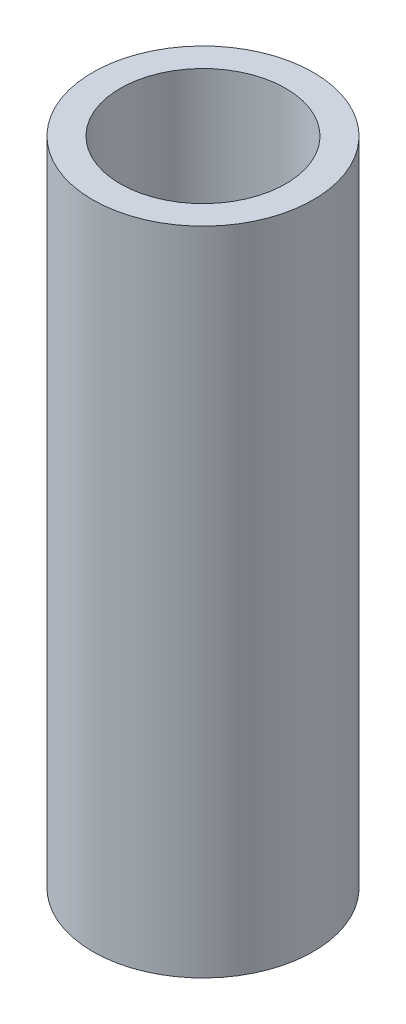
ISO-10303-21;
HEADER;
FILE_DESCRIPTION(('STEP AP214'),'2;1');
FILE_NAME('part.step','',(''),(''),'','','');
FILE_SCHEMA(('AUTOMOTIVE_DESIGN { 1 0 10303 214 1 1 1 1 }'));
ENDSEC;
DATA;
#1=APPLICATION_CONTEXT('core data for automotive mechanical design processes');
#2=APPLICATION_PROTOCOL_DEFINITION('international standard','automotive_design',2000,#1);
#3=PRODUCT_CONTEXT('',#1,'mechanical');
#4=PRODUCT('Part','Part','',(#3));
#5=PRODUCT_RELATED_PRODUCT_CATEGORY('part','',(#4));
#6=PRODUCT_DEFINITION_FORMATION('','',#4);
#7=PRODUCT_DEFINITION_CONTEXT('part definition',#1,'design');
#8=PRODUCT_DEFINITION('design','',#6,#7);
#9=PRODUCT_DEFINITION_SHAPE('','',#8);
#10=(LENGTH_UNIT() NAMED_UNIT(*) SI_UNIT(.MILLI.,.METRE.));
#11=(NAMED_UNIT(*) PLANE_ANGLE_UNIT() SI_UNIT($,.RADIAN.));
#12=(NAMED_UNIT(*) SI_UNIT($,.STERADIAN.) SOLID_ANGLE_UNIT());
#13=UNCERTAINTY_MEASURE_WITH_UNIT(LENGTH_MEASURE(1.E-05),#10,'distance_accuracy_value','');
#14=(GEOMETRIC_REPRESENTATION_CONTEXT(3) GLOBAL_UNCERTAINTY_ASSIGNED_CONTEXT((#13)) GLOBAL_UNIT_ASSIGNED_CONTEXT((#10,
#11,#12)) REPRESENTATION_CONTEXT('',''));
#15=CARTESIAN_POINT('',(0.,0.,0.));
#16=DIRECTION('',(0.,0.,1.));
#17=DIRECTION('',(1.,0.,0.));
#18=AXIS2_PLACEMENT_3D('',#15,#16,#17);
#19=CARTESIAN_POINT('',(0.,59.,0.));
#20=DIRECTION('',(0.,1.,0.));
#21=DIRECTION('',(0.,0.,1.));
#22=AXIS2_PLACEMENT_3D('',#19,#20,#21);
#23=PLANE('',#22);
#24=CARTESIAN_POINT('',(0.,59.,0.));
#25=DIRECTION('',(0.,1.,0.));
#26=DIRECTION('',(0.,0.,1.));
#27=AXIS2_PLACEMENT_3D('',#24,#25,#26);
#28=CIRCLE('',#27,10.);
#29=CARTESIAN_POINT('',(0.,59.,10.));
#30=VERTEX_POINT('',#29);
#31=EDGE_CURVE('E10',#30,#30,#28,.T.);
#32=ORIENTED_EDGE('',*,*,#31,.T.);
#33=EDGE_LOOP('',(#32));
#34=FACE_BOUND('',#33,.T.);
#35=CARTESIAN_POINT('',(0.,59.,0.));
#36=DIRECTION('',(0.,1.,0.));
#37=DIRECTION('',(0.,0.,1.));
#38=AXIS2_PLACEMENT_3D('',#35,#36,#37);
#39=CIRCLE('',#38,7.5);
#40=CARTESIAN_POINT('',(0.,59.,7.5));
#41=VERTEX_POINT('',#40);
#42=EDGE_CURVE('E44',#41,#41,#39,.T.);
#43=ORIENTED_EDGE('',*,*,#42,.F.);
#44=EDGE_LOOP('',(#43));
#45=FACE_BOUND('',#44,.T.);
#46=ADVANCED_FACE('F33',(#34,#45),#23,.T.);
#47=CARTESIAN_POINT('',(0.,0.,0.));
#48=DIRECTION('',(0.,1.,0.));
#49=DIRECTION('',(0.,0.,1.));
#50=AXIS2_PLACEMENT_3D('',#47,#48,#49);
#51=PLANE('',#50);
#52=CARTESIAN_POINT('',(0.,0.,0.));
#53=DIRECTION('',(0.,1.,0.));
#54=DIRECTION('',(0.,0.,1.));
#55=AXIS2_PLACEMENT_3D('',#52,#53,#54);
#56=CIRCLE('',#55,10.);
#57=CARTESIAN_POINT('',(0.,0.,10.));
#58=VERTEX_POINT('',#57);
#59=EDGE_CURVE('E37',#58,#58,#56,.T.);
#60=ORIENTED_EDGE('',*,*,#59,.F.);
#61=EDGE_LOOP('',(#60));
#62=FACE_BOUND('',#61,.T.);
#63=CARTESIAN_POINT('',(0.,0.,0.));
#64=DIRECTION('',(0.,1.,0.));
#65=DIRECTION('',(0.,0.,1.));
#66=AXIS2_PLACEMENT_3D('',#63,#64,#65);
#67=CIRCLE('',#66,7.5);
#68=CARTESIAN_POINT('',(0.,0.,7.5));
#69=VERTEX_POINT('',#68);
#70=EDGE_CURVE('E46',#69,#69,#67,.T.);
#71=ORIENTED_EDGE('',*,*,#70,.T.);
#72=EDGE_LOOP('',(#71));
#73=FACE_BOUND('',#72,.T.);
#74=ADVANCED_FACE('F56',(#62,#73),#51,.F.);
#75=CARTESIAN_POINT('',(0.,59.,0.));
#76=DIRECTION('',(0.,-1.,0.));
#77=DIRECTION('',(0.,0.,-1.));
#78=AXIS2_PLACEMENT_3D('',#75,#76,#77);
#79=CYLINDRICAL_SURFACE('',#78,10.);
#80=ORIENTED_EDGE('',*,*,#31,.F.);
#81=EDGE_LOOP('',(#80));
#82=FACE_BOUND('',#81,.T.);
#83=ORIENTED_EDGE('',*,*,#59,.T.);
#84=EDGE_LOOP('',(#83));
#85=FACE_BOUND('',#84,.T.);
#86=ADVANCED_FACE('F35',(#82,#85),#79,.T.);
#87=CARTESIAN_POINT('',(0.,59.,0.));
#88=DIRECTION('',(0.,-1.,0.));
#89=DIRECTION('',(0.,0.,-1.));
#90=AXIS2_PLACEMENT_3D('',#87,#88,#89);
#91=CYLINDRICAL_SURFACE('',#90,7.5);
#92=ORIENTED_EDGE('',*,*,#42,.T.);
#93=EDGE_LOOP('',(#92));
#94=FACE_BOUND('',#93,.T.);
#95=ORIENTED_EDGE('',*,*,#70,.F.);
#96=EDGE_LOOP('',(#95));
#97=FACE_BOUND('',#96,.T.);
#98=ADVANCED_FACE('F52',(#94,#97),#91,.F.);
#99=CLOSED_SHELL('',(#46,#74,#86,#98));
#100=MANIFOLD_SOLID_BREP('B2',#99);
#101=ADVANCED_BREP_SHAPE_REPRESENTATION('',(#18,#100),#14);
#102=SHAPE_DEFINITION_REPRESENTATION(#9,#101);
ENDSEC;
END-ISO-10303-21;
